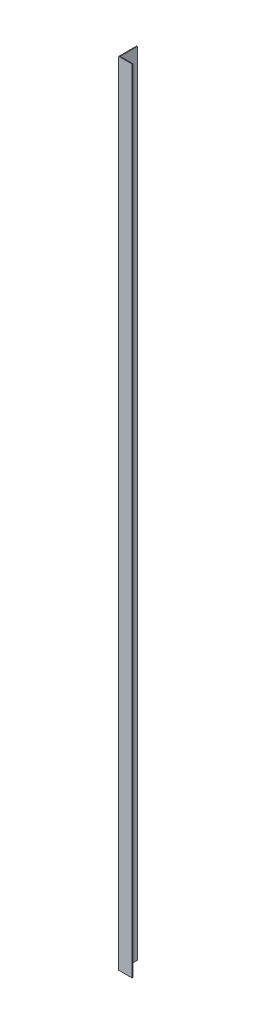
ISO-10303-21;
HEADER;
FILE_DESCRIPTION(('STEP AP214'),'2;1');
FILE_NAME('part.step','',(''),(''),'','','');
FILE_SCHEMA(('AUTOMOTIVE_DESIGN { 1 0 10303 214 1 1 1 1 }'));
ENDSEC;
DATA;
#1=APPLICATION_CONTEXT('core data for automotive mechanical design processes');
#2=APPLICATION_PROTOCOL_DEFINITION('international standard','automotive_design',2000,#1);
#3=PRODUCT_CONTEXT('',#1,'mechanical');
#4=PRODUCT('Part','Part','',(#3));
#5=PRODUCT_RELATED_PRODUCT_CATEGORY('part','',(#4));
#6=PRODUCT_DEFINITION_FORMATION('','',#4);
#7=PRODUCT_DEFINITION_CONTEXT('part definition',#1,'design');
#8=PRODUCT_DEFINITION('design','',#6,#7);
#9=PRODUCT_DEFINITION_SHAPE('','',#8);
#10=(LENGTH_UNIT() NAMED_UNIT(*) SI_UNIT(.MILLI.,.METRE.));
#11=(NAMED_UNIT(*) PLANE_ANGLE_UNIT() SI_UNIT($,.RADIAN.));
#12=(NAMED_UNIT(*) SI_UNIT($,.STERADIAN.) SOLID_ANGLE_UNIT());
#13=UNCERTAINTY_MEASURE_WITH_UNIT(LENGTH_MEASURE(1.E-05),#10,'distance_accuracy_value','');
#14=(GEOMETRIC_REPRESENTATION_CONTEXT(3) GLOBAL_UNCERTAINTY_ASSIGNED_CONTEXT((#13)) GLOBAL_UNIT_ASSIGNED_CONTEXT((#10,
#11,#12)) REPRESENTATION_CONTEXT('',''));
#15=CARTESIAN_POINT('',(0.,0.,0.));
#16=DIRECTION('',(0.,0.,1.));
#17=DIRECTION('',(1.,0.,0.));
#18=AXIS2_PLACEMENT_3D('',#15,#16,#17);
#19=CARTESIAN_POINT('',(670.,1970.,40.));
#20=DIRECTION('',(0.,0.,-1.));
#21=DIRECTION('',(-1.,0.,0.));
#22=AXIS2_PLACEMENT_3D('',#19,#20,#21);
#23=PLANE('',#22);
#24=DIRECTION('',(1.,0.,0.));
#25=VECTOR('',#24,1.);
#26=CARTESIAN_POINT('',(670.,200.,40.));
#27=LINE('',#26,#25);
#28=CARTESIAN_POINT('',(670.,200.,40.));
#29=VERTEX_POINT('',#28);
#30=CARTESIAN_POINT('',(700.,200.,40.));
#31=VERTEX_POINT('',#30);
#32=EDGE_CURVE('E123',#29,#31,#27,.T.);
#33=ORIENTED_EDGE('',*,*,#32,.T.);
#34=DIRECTION('',(0.,-1.,0.));
#35=VECTOR('',#34,1.);
#36=CARTESIAN_POINT('',(700.,1970.,40.));
#37=LINE('',#36,#35);
#38=CARTESIAN_POINT('',(700.,1970.,40.));
#39=VERTEX_POINT('',#38);
#40=EDGE_CURVE('E11',#39,#31,#37,.T.);
#41=ORIENTED_EDGE('',*,*,#40,.F.);
#42=DIRECTION('',(1.,0.,0.));
#43=VECTOR('',#42,1.);
#44=CARTESIAN_POINT('',(670.,1970.,40.));
#45=LINE('',#44,#43);
#46=CARTESIAN_POINT('',(670.,1970.,40.));
#47=VERTEX_POINT('',#46);
#48=EDGE_CURVE('E133',#47,#39,#45,.T.);
#49=ORIENTED_EDGE('',*,*,#48,.F.);
#50=DIRECTION('',(0.,-1.,0.));
#51=VECTOR('',#50,1.);
#52=CARTESIAN_POINT('',(670.,1970.,40.));
#53=LINE('',#52,#51);
#54=EDGE_CURVE('E119',#47,#29,#53,.T.);
#55=ORIENTED_EDGE('',*,*,#54,.T.);
#56=EDGE_LOOP('',(#33,#41,#49,#55));
#57=FACE_BOUND('',#56,.T.);
#58=ADVANCED_FACE('F39',(#57),#23,.F.);
#59=CARTESIAN_POINT('',(700.,1970.,40.));
#60=DIRECTION('',(-1.,0.,0.));
#61=DIRECTION('',(0.,0.,1.));
#62=AXIS2_PLACEMENT_3D('',#59,#60,#61);
#63=PLANE('',#62);
#64=DIRECTION('',(0.,0.,-1.));
#65=VECTOR('',#64,1.);
#66=CARTESIAN_POINT('',(700.,200.,40.));
#67=LINE('',#66,#65);
#68=CARTESIAN_POINT('',(700.,200.,38.5));
#69=VERTEX_POINT('',#68);
#70=EDGE_CURVE('E126',#31,#69,#67,.T.);
#71=ORIENTED_EDGE('',*,*,#70,.T.);
#72=DIRECTION('',(0.,-1.,0.));
#73=VECTOR('',#72,1.);
#74=CARTESIAN_POINT('',(700.,1970.,38.5));
#75=LINE('',#74,#73);
#76=CARTESIAN_POINT('',(700.,1970.,38.5));
#77=VERTEX_POINT('',#76);
#78=EDGE_CURVE('E47',#77,#69,#75,.T.);
#79=ORIENTED_EDGE('',*,*,#78,.F.);
#80=DIRECTION('',(0.,0.,-1.));
#81=VECTOR('',#80,1.);
#82=CARTESIAN_POINT('',(700.,1970.,40.));
#83=LINE('',#82,#81);
#84=EDGE_CURVE('E92',#39,#77,#83,.T.);
#85=ORIENTED_EDGE('',*,*,#84,.F.);
#86=ORIENTED_EDGE('',*,*,#40,.T.);
#87=EDGE_LOOP('',(#71,#79,#85,#86));
#88=FACE_BOUND('',#87,.T.);
#89=ADVANCED_FACE('F157',(#88),#63,.F.);
#90=CARTESIAN_POINT('',(700.,1970.,38.5));
#91=DIRECTION('',(0.,0.,1.));
#92=DIRECTION('',(1.,0.,0.));
#93=AXIS2_PLACEMENT_3D('',#90,#91,#92);
#94=PLANE('',#93);
#95=DIRECTION('',(-1.,0.,0.));
#96=VECTOR('',#95,1.);
#97=CARTESIAN_POINT('',(700.,200.,38.5));
#98=LINE('',#97,#96);
#99=CARTESIAN_POINT('',(671.5,200.,38.5));
#100=VERTEX_POINT('',#99);
#101=EDGE_CURVE('E128',#69,#100,#98,.T.);
#102=ORIENTED_EDGE('',*,*,#101,.T.);
#103=DIRECTION('',(0.,-1.,0.));
#104=VECTOR('',#103,1.);
#105=CARTESIAN_POINT('',(671.5,1970.,38.5));
#106=LINE('',#105,#104);
#107=CARTESIAN_POINT('',(671.5,1970.,38.5));
#108=VERTEX_POINT('',#107);
#109=EDGE_CURVE('E114',#108,#100,#106,.T.);
#110=ORIENTED_EDGE('',*,*,#109,.F.);
#111=DIRECTION('',(-1.,0.,0.));
#112=VECTOR('',#111,1.);
#113=CARTESIAN_POINT('',(700.,1970.,38.5));
#114=LINE('',#113,#112);
#115=EDGE_CURVE('E105',#77,#108,#114,.T.);
#116=ORIENTED_EDGE('',*,*,#115,.F.);
#117=ORIENTED_EDGE('',*,*,#78,.T.);
#118=EDGE_LOOP('',(#102,#110,#116,#117));
#119=FACE_BOUND('',#118,.T.);
#120=ADVANCED_FACE('F139',(#119),#94,.F.);
#121=CARTESIAN_POINT('',(671.5,1970.,38.5));
#122=DIRECTION('',(-1.,0.,0.));
#123=DIRECTION('',(0.,0.,1.));
#124=AXIS2_PLACEMENT_3D('',#121,#122,#123);
#125=PLANE('',#124);
#126=DIRECTION('',(0.,0.,-1.));
#127=VECTOR('',#126,1.);
#128=CARTESIAN_POINT('',(671.5,200.,38.5));
#129=LINE('',#128,#127);
#130=CARTESIAN_POINT('',(671.5,200.,0.));
#131=VERTEX_POINT('',#130);
#132=EDGE_CURVE('E113',#100,#131,#129,.T.);
#133=ORIENTED_EDGE('',*,*,#132,.T.);
#134=DIRECTION('',(0.,-1.,0.));
#135=VECTOR('',#134,1.);
#136=CARTESIAN_POINT('',(671.5,1970.,0.));
#137=LINE('',#136,#135);
#138=CARTESIAN_POINT('',(671.5,1970.,0.));
#139=VERTEX_POINT('',#138);
#140=EDGE_CURVE('E110',#139,#131,#137,.T.);
#141=ORIENTED_EDGE('',*,*,#140,.F.);
#142=DIRECTION('',(0.,0.,-1.));
#143=VECTOR('',#142,1.);
#144=CARTESIAN_POINT('',(671.5,1970.,38.5));
#145=LINE('',#144,#143);
#146=EDGE_CURVE('E99',#108,#139,#145,.T.);
#147=ORIENTED_EDGE('',*,*,#146,.F.);
#148=ORIENTED_EDGE('',*,*,#109,.T.);
#149=EDGE_LOOP('',(#133,#141,#147,#148));
#150=FACE_BOUND('',#149,.T.);
#151=ADVANCED_FACE('F111',(#150),#125,.F.);
#152=CARTESIAN_POINT('',(671.5,1970.,0.));
#153=DIRECTION('',(0.,0.,1.));
#154=DIRECTION('',(1.,0.,0.));
#155=AXIS2_PLACEMENT_3D('',#152,#153,#154);
#156=PLANE('',#155);
#157=DIRECTION('',(-1.,0.,0.));
#158=VECTOR('',#157,1.);
#159=CARTESIAN_POINT('',(671.5,200.,0.));
#160=LINE('',#159,#158);
#161=CARTESIAN_POINT('',(670.,200.,0.));
#162=VERTEX_POINT('',#161);
#163=EDGE_CURVE('E78',#131,#162,#160,.T.);
#164=ORIENTED_EDGE('',*,*,#163,.T.);
#165=DIRECTION('',(0.,-1.,0.));
#166=VECTOR('',#165,1.);
#167=CARTESIAN_POINT('',(670.,1970.,0.));
#168=LINE('',#167,#166);
#169=CARTESIAN_POINT('',(670.,1970.,0.));
#170=VERTEX_POINT('',#169);
#171=EDGE_CURVE('E115',#170,#162,#168,.T.);
#172=ORIENTED_EDGE('',*,*,#171,.F.);
#173=DIRECTION('',(-1.,0.,0.));
#174=VECTOR('',#173,1.);
#175=CARTESIAN_POINT('',(671.5,1970.,0.));
#176=LINE('',#175,#174);
#177=EDGE_CURVE('E103',#139,#170,#176,.T.);
#178=ORIENTED_EDGE('',*,*,#177,.F.);
#179=ORIENTED_EDGE('',*,*,#140,.T.);
#180=EDGE_LOOP('',(#164,#172,#178,#179));
#181=FACE_BOUND('',#180,.T.);
#182=ADVANCED_FACE('F117',(#181),#156,.F.);
#183=CARTESIAN_POINT('',(670.,1970.,0.));
#184=DIRECTION('',(1.,0.,0.));
#185=DIRECTION('',(0.,0.,-1.));
#186=AXIS2_PLACEMENT_3D('',#183,#184,#185);
#187=PLANE('',#186);
#188=DIRECTION('',(0.,0.,1.));
#189=VECTOR('',#188,1.);
#190=CARTESIAN_POINT('',(670.,200.,0.));
#191=LINE('',#190,#189);
#192=EDGE_CURVE('E84',#162,#29,#191,.T.);
#193=ORIENTED_EDGE('',*,*,#192,.T.);
#194=ORIENTED_EDGE('',*,*,#54,.F.);
#195=DIRECTION('',(0.,0.,1.));
#196=VECTOR('',#195,1.);
#197=CARTESIAN_POINT('',(670.,1970.,0.));
#198=LINE('',#197,#196);
#199=EDGE_CURVE('E55',#170,#47,#198,.T.);
#200=ORIENTED_EDGE('',*,*,#199,.F.);
#201=ORIENTED_EDGE('',*,*,#171,.T.);
#202=EDGE_LOOP('',(#193,#194,#200,#201));
#203=FACE_BOUND('',#202,.T.);
#204=ADVANCED_FACE('F146',(#203),#187,.F.);
#205=CARTESIAN_POINT('',(0.,1970.,0.));
#206=DIRECTION('',(0.,1.,0.));
#207=DIRECTION('',(0.,0.,1.));
#208=AXIS2_PLACEMENT_3D('',#205,#206,#207);
#209=PLANE('',#208);
#210=ORIENTED_EDGE('',*,*,#48,.T.);
#211=ORIENTED_EDGE('',*,*,#84,.T.);
#212=ORIENTED_EDGE('',*,*,#115,.T.);
#213=ORIENTED_EDGE('',*,*,#146,.T.);
#214=ORIENTED_EDGE('',*,*,#177,.T.);
#215=ORIENTED_EDGE('',*,*,#199,.T.);
#216=EDGE_LOOP('',(#210,#211,#212,#213,#214,#215));
#217=FACE_BOUND('',#216,.T.);
#218=ADVANCED_FACE('F101',(#217),#209,.T.);
#219=CARTESIAN_POINT('',(0.,200.,0.));
#220=DIRECTION('',(0.,1.,0.));
#221=DIRECTION('',(0.,0.,1.));
#222=AXIS2_PLACEMENT_3D('',#219,#220,#221);
#223=PLANE('',#222);
#224=ORIENTED_EDGE('',*,*,#32,.F.);
#225=ORIENTED_EDGE('',*,*,#192,.F.);
#226=ORIENTED_EDGE('',*,*,#163,.F.);
#227=ORIENTED_EDGE('',*,*,#132,.F.);
#228=ORIENTED_EDGE('',*,*,#101,.F.);
#229=ORIENTED_EDGE('',*,*,#70,.F.);
#230=EDGE_LOOP('',(#224,#225,#226,#227,#228,#229));
#231=FACE_BOUND('',#230,.T.);
#232=ADVANCED_FACE('F142',(#231),#223,.F.);
#233=CLOSED_SHELL('',(#58,#89,#120,#151,#182,#204,#218,#232));
#234=MANIFOLD_SOLID_BREP('B2',#233);
#235=ADVANCED_BREP_SHAPE_REPRESENTATION('',(#18,#234),#14);
#236=SHAPE_DEFINITION_REPRESENTATION(#9,#235);
ENDSEC;
END-ISO-10303-21;
